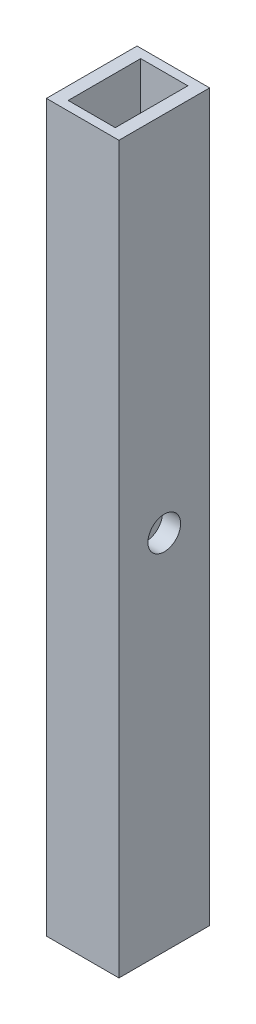
ISO-10303-21;
HEADER;
FILE_DESCRIPTION(('STEP AP214'),'2;1');
FILE_NAME('part.step','',(''),(''),'','','');
FILE_SCHEMA(('AUTOMOTIVE_DESIGN { 1 0 10303 214 1 1 1 1 }'));
ENDSEC;
DATA;
#1=APPLICATION_CONTEXT('core data for automotive mechanical design processes');
#2=APPLICATION_PROTOCOL_DEFINITION('international standard','automotive_design',2000,#1);
#3=PRODUCT_CONTEXT('',#1,'mechanical');
#4=PRODUCT('Part','Part','',(#3));
#5=PRODUCT_RELATED_PRODUCT_CATEGORY('part','',(#4));
#6=PRODUCT_DEFINITION_FORMATION('','',#4);
#7=PRODUCT_DEFINITION_CONTEXT('part definition',#1,'design');
#8=PRODUCT_DEFINITION('design','',#6,#7);
#9=PRODUCT_DEFINITION_SHAPE('','',#8);
#10=(LENGTH_UNIT() NAMED_UNIT(*) SI_UNIT(.MILLI.,.METRE.));
#11=(NAMED_UNIT(*) PLANE_ANGLE_UNIT() SI_UNIT($,.RADIAN.));
#12=(NAMED_UNIT(*) SI_UNIT($,.STERADIAN.) SOLID_ANGLE_UNIT());
#13=UNCERTAINTY_MEASURE_WITH_UNIT(LENGTH_MEASURE(1.E-05),#10,'distance_accuracy_value','');
#14=(GEOMETRIC_REPRESENTATION_CONTEXT(3) GLOBAL_UNCERTAINTY_ASSIGNED_CONTEXT((#13)) GLOBAL_UNIT_ASSIGNED_CONTEXT((#10,
#11,#12)) REPRESENTATION_CONTEXT('',''));
#15=CARTESIAN_POINT('',(0.,0.,0.));
#16=DIRECTION('',(0.,0.,1.));
#17=DIRECTION('',(1.,0.,0.));
#18=AXIS2_PLACEMENT_3D('',#15,#16,#17);
#19=CARTESIAN_POINT('',(50.,500.,-62.5));
#20=DIRECTION('',(-1.,0.,0.));
#21=DIRECTION('',(0.,0.,1.));
#22=AXIS2_PLACEMENT_3D('',#19,#20,#21);
#23=PLANE('',#22);
#24=CARTESIAN_POINT('',(50.,0.,0.));
#25=DIRECTION('',(1.,0.,0.));
#26=DIRECTION('',(0.,0.,-1.));
#27=AXIS2_PLACEMENT_3D('',#24,#25,#26);
#28=CIRCLE('',#27,22.5);
#29=CARTESIAN_POINT('',(50.,0.,-22.5));
#30=VERTEX_POINT('',#29);
#31=EDGE_CURVE('E174',#30,#30,#28,.T.);
#32=ORIENTED_EDGE('',*,*,#31,.F.);
#33=EDGE_LOOP('',(#32));
#34=FACE_BOUND('',#33,.T.);
#35=DIRECTION('',(0.,0.,-1.));
#36=VECTOR('',#35,1.);
#37=CARTESIAN_POINT('',(50.,-500.,-62.5));
#38=LINE('',#37,#36);
#39=CARTESIAN_POINT('',(50.,-500.,62.5));
#40=VERTEX_POINT('',#39);
#41=CARTESIAN_POINT('',(50.,-500.,-62.5));
#42=VERTEX_POINT('',#41);
#43=EDGE_CURVE('E182',#40,#42,#38,.T.);
#44=ORIENTED_EDGE('',*,*,#43,.T.);
#45=DIRECTION('',(0.,-1.,0.));
#46=VECTOR('',#45,1.);
#47=CARTESIAN_POINT('',(50.,500.,-62.5));
#48=LINE('',#47,#46);
#49=CARTESIAN_POINT('',(50.,500.,-62.5));
#50=VERTEX_POINT('',#49);
#51=EDGE_CURVE('E11',#50,#42,#48,.T.);
#52=ORIENTED_EDGE('',*,*,#51,.F.);
#53=DIRECTION('',(0.,0.,-1.));
#54=VECTOR('',#53,1.);
#55=CARTESIAN_POINT('',(50.,500.,-62.5));
#56=LINE('',#55,#54);
#57=CARTESIAN_POINT('',(50.,500.,62.5));
#58=VERTEX_POINT('',#57);
#59=EDGE_CURVE('E186',#58,#50,#56,.T.);
#60=ORIENTED_EDGE('',*,*,#59,.F.);
#61=DIRECTION('',(0.,-1.,0.));
#62=VECTOR('',#61,1.);
#63=CARTESIAN_POINT('',(50.,500.,62.5));
#64=LINE('',#63,#62);
#65=EDGE_CURVE('E196',#58,#40,#64,.T.);
#66=ORIENTED_EDGE('',*,*,#65,.T.);
#67=EDGE_LOOP('',(#44,#52,#60,#66));
#68=FACE_BOUND('',#67,.T.);
#69=ADVANCED_FACE('F45',(#34,#68),#23,.F.);
#70=CARTESIAN_POINT('',(-50.,500.,-62.5));
#71=DIRECTION('',(0.,0.,1.));
#72=DIRECTION('',(1.,0.,0.));
#73=AXIS2_PLACEMENT_3D('',#70,#71,#72);
#74=PLANE('',#73);
#75=DIRECTION('',(-1.,0.,0.));
#76=VECTOR('',#75,1.);
#77=CARTESIAN_POINT('',(-50.,-500.,-62.5));
#78=LINE('',#77,#76);
#79=CARTESIAN_POINT('',(-50.,-500.,-62.5));
#80=VERTEX_POINT('',#79);
#81=EDGE_CURVE('E200',#42,#80,#78,.T.);
#82=ORIENTED_EDGE('',*,*,#81,.T.);
#83=DIRECTION('',(0.,-1.,0.));
#84=VECTOR('',#83,1.);
#85=CARTESIAN_POINT('',(-50.,500.,-62.5));
#86=LINE('',#85,#84);
#87=CARTESIAN_POINT('',(-50.,500.,-62.5));
#88=VERTEX_POINT('',#87);
#89=EDGE_CURVE('E53',#88,#80,#86,.T.);
#90=ORIENTED_EDGE('',*,*,#89,.F.);
#91=DIRECTION('',(-1.,0.,0.));
#92=VECTOR('',#91,1.);
#93=CARTESIAN_POINT('',(-50.,500.,-62.5));
#94=LINE('',#93,#92);
#95=EDGE_CURVE('E97',#50,#88,#94,.T.);
#96=ORIENTED_EDGE('',*,*,#95,.F.);
#97=ORIENTED_EDGE('',*,*,#51,.T.);
#98=EDGE_LOOP('',(#82,#90,#96,#97));
#99=FACE_BOUND('',#98,.T.);
#100=ADVANCED_FACE('F237',(#99),#74,.F.);
#101=CARTESIAN_POINT('',(-50.,500.,-62.5));
#102=DIRECTION('',(1.,0.,0.));
#103=DIRECTION('',(0.,0.,-1.));
#104=AXIS2_PLACEMENT_3D('',#101,#102,#103);
#105=PLANE('',#104);
#106=CARTESIAN_POINT('',(-50.,0.,0.));
#107=DIRECTION('',(-1.,0.,0.));
#108=DIRECTION('',(0.,0.,1.));
#109=AXIS2_PLACEMENT_3D('',#106,#107,#108);
#110=CIRCLE('',#109,22.5);
#111=CARTESIAN_POINT('',(-50.,0.,22.5));
#112=VERTEX_POINT('',#111);
#113=EDGE_CURVE('E164',#112,#112,#110,.T.);
#114=ORIENTED_EDGE('',*,*,#113,.F.);
#115=EDGE_LOOP('',(#114));
#116=FACE_BOUND('',#115,.T.);
#117=DIRECTION('',(0.,0.,1.));
#118=VECTOR('',#117,1.);
#119=CARTESIAN_POINT('',(-50.,-500.,-62.5));
#120=LINE('',#119,#118);
#121=CARTESIAN_POINT('',(-50.,-500.,62.5));
#122=VERTEX_POINT('',#121);
#123=EDGE_CURVE('E203',#80,#122,#120,.T.);
#124=ORIENTED_EDGE('',*,*,#123,.T.);
#125=DIRECTION('',(0.,-1.,0.));
#126=VECTOR('',#125,1.);
#127=CARTESIAN_POINT('',(-50.,500.,62.5));
#128=LINE('',#127,#126);
#129=CARTESIAN_POINT('',(-50.,500.,62.5));
#130=VERTEX_POINT('',#129);
#131=EDGE_CURVE('E210',#130,#122,#128,.T.);
#132=ORIENTED_EDGE('',*,*,#131,.F.);
#133=DIRECTION('',(0.,0.,1.));
#134=VECTOR('',#133,1.);
#135=CARTESIAN_POINT('',(-50.,500.,-62.5));
#136=LINE('',#135,#134);
#137=EDGE_CURVE('E191',#88,#130,#136,.T.);
#138=ORIENTED_EDGE('',*,*,#137,.F.);
#139=ORIENTED_EDGE('',*,*,#89,.T.);
#140=EDGE_LOOP('',(#124,#132,#138,#139));
#141=FACE_BOUND('',#140,.T.);
#142=ADVANCED_FACE('F217',(#116,#141),#105,.F.);
#143=CARTESIAN_POINT('',(-50.,500.,62.5));
#144=DIRECTION('',(0.,0.,-1.));
#145=DIRECTION('',(-1.,0.,0.));
#146=AXIS2_PLACEMENT_3D('',#143,#144,#145);
#147=PLANE('',#146);
#148=DIRECTION('',(1.,0.,0.));
#149=VECTOR('',#148,1.);
#150=CARTESIAN_POINT('',(-50.,-500.,62.5));
#151=LINE('',#150,#149);
#152=EDGE_CURVE('E90',#122,#40,#151,.T.);
#153=ORIENTED_EDGE('',*,*,#152,.T.);
#154=ORIENTED_EDGE('',*,*,#65,.F.);
#155=DIRECTION('',(1.,0.,0.));
#156=VECTOR('',#155,1.);
#157=CARTESIAN_POINT('',(-50.,500.,62.5));
#158=LINE('',#157,#156);
#159=EDGE_CURVE('E69',#130,#58,#158,.T.);
#160=ORIENTED_EDGE('',*,*,#159,.F.);
#161=ORIENTED_EDGE('',*,*,#131,.T.);
#162=EDGE_LOOP('',(#153,#154,#160,#161));
#163=FACE_BOUND('',#162,.T.);
#164=ADVANCED_FACE('F225',(#163),#147,.F.);
#165=CARTESIAN_POINT('',(0.,500.,0.));
#166=DIRECTION('',(0.,1.,0.));
#167=DIRECTION('',(0.,0.,1.));
#168=AXIS2_PLACEMENT_3D('',#165,#166,#167);
#169=PLANE('',#168);
#170=DIRECTION('',(0.,0.,-1.));
#171=VECTOR('',#170,1.);
#172=CARTESIAN_POINT('',(32.5,500.,-50.));
#173=LINE('',#172,#171);
#174=CARTESIAN_POINT('',(32.5,500.,50.));
#175=VERTEX_POINT('',#174);
#176=CARTESIAN_POINT('',(32.5,500.,-50.));
#177=VERTEX_POINT('',#176);
#178=EDGE_CURVE('E60',#175,#177,#173,.T.);
#179=ORIENTED_EDGE('',*,*,#178,.F.);
#180=DIRECTION('',(1.,0.,0.));
#181=VECTOR('',#180,1.);
#182=CARTESIAN_POINT('',(-32.5,500.,50.));
#183=LINE('',#182,#181);
#184=CARTESIAN_POINT('',(-32.5,500.,50.));
#185=VERTEX_POINT('',#184);
#186=EDGE_CURVE('E142',#185,#175,#183,.T.);
#187=ORIENTED_EDGE('',*,*,#186,.F.);
#188=DIRECTION('',(0.,0.,1.));
#189=VECTOR('',#188,1.);
#190=CARTESIAN_POINT('',(-32.5,500.,-50.));
#191=LINE('',#190,#189);
#192=CARTESIAN_POINT('',(-32.5,500.,-50.));
#193=VERTEX_POINT('',#192);
#194=EDGE_CURVE('E146',#193,#185,#191,.T.);
#195=ORIENTED_EDGE('',*,*,#194,.F.);
#196=DIRECTION('',(-1.,0.,0.));
#197=VECTOR('',#196,1.);
#198=CARTESIAN_POINT('',(-32.5,500.,-50.));
#199=LINE('',#198,#197);
#200=EDGE_CURVE('E155',#177,#193,#199,.T.);
#201=ORIENTED_EDGE('',*,*,#200,.F.);
#202=EDGE_LOOP('',(#179,#187,#195,#201));
#203=FACE_BOUND('',#202,.T.);
#204=ORIENTED_EDGE('',*,*,#59,.T.);
#205=ORIENTED_EDGE('',*,*,#95,.T.);
#206=ORIENTED_EDGE('',*,*,#137,.T.);
#207=ORIENTED_EDGE('',*,*,#159,.T.);
#208=EDGE_LOOP('',(#204,#205,#206,#207));
#209=FACE_BOUND('',#208,.T.);
#210=ADVANCED_FACE('F227',(#203,#209),#169,.T.);
#211=CARTESIAN_POINT('',(0.,-500.,0.));
#212=DIRECTION('',(0.,1.,0.));
#213=DIRECTION('',(0.,0.,1.));
#214=AXIS2_PLACEMENT_3D('',#211,#212,#213);
#215=PLANE('',#214);
#216=ORIENTED_EDGE('',*,*,#43,.F.);
#217=ORIENTED_EDGE('',*,*,#152,.F.);
#218=ORIENTED_EDGE('',*,*,#123,.F.);
#219=ORIENTED_EDGE('',*,*,#81,.F.);
#220=EDGE_LOOP('',(#216,#217,#218,#219));
#221=FACE_BOUND('',#220,.T.);
#222=ADVANCED_FACE('F221',(#221),#215,.F.);
#223=CARTESIAN_POINT('',(25.,0.,0.));
#224=DIRECTION('',(1.,0.,0.));
#225=DIRECTION('',(0.,0.,-1.));
#226=AXIS2_PLACEMENT_3D('',#223,#224,#225);
#227=CYLINDRICAL_SURFACE('',#226,22.5);
#228=CARTESIAN_POINT('',(25.,0.,0.));
#229=DIRECTION('',(1.,0.,0.));
#230=DIRECTION('',(0.,0.,-1.));
#231=AXIS2_PLACEMENT_3D('',#228,#229,#230);
#232=CIRCLE('',#231,22.5);
#233=CARTESIAN_POINT('',(25.,0.,-22.5));
#234=VERTEX_POINT('',#233);
#235=EDGE_CURVE('E178',#234,#234,#232,.T.);
#236=ORIENTED_EDGE('',*,*,#235,.F.);
#237=EDGE_LOOP('',(#236));
#238=FACE_BOUND('',#237,.T.);
#239=ORIENTED_EDGE('',*,*,#31,.T.);
#240=EDGE_LOOP('',(#239));
#241=FACE_BOUND('',#240,.T.);
#242=ADVANCED_FACE('F248',(#238,#241),#227,.F.);
#243=CARTESIAN_POINT('',(25.,0.,0.));
#244=DIRECTION('',(1.,0.,0.));
#245=DIRECTION('',(0.,0.,-1.));
#246=AXIS2_PLACEMENT_3D('',#243,#244,#245);
#247=PLANE('',#246);
#248=ORIENTED_EDGE('',*,*,#235,.T.);
#249=EDGE_LOOP('',(#248));
#250=FACE_BOUND('',#249,.T.);
#251=ADVANCED_FACE('F249',(#250),#247,.T.);
#252=CARTESIAN_POINT('',(-25.,0.,0.));
#253=DIRECTION('',(-1.,0.,0.));
#254=DIRECTION('',(0.,0.,1.));
#255=AXIS2_PLACEMENT_3D('',#252,#253,#254);
#256=CYLINDRICAL_SURFACE('',#255,22.5);
#257=CARTESIAN_POINT('',(-25.,0.,0.));
#258=DIRECTION('',(-1.,0.,0.));
#259=DIRECTION('',(0.,0.,1.));
#260=AXIS2_PLACEMENT_3D('',#257,#258,#259);
#261=CIRCLE('',#260,22.5);
#262=CARTESIAN_POINT('',(-25.,0.,22.5));
#263=VERTEX_POINT('',#262);
#264=EDGE_CURVE('E170',#263,#263,#261,.T.);
#265=ORIENTED_EDGE('',*,*,#264,.F.);
#266=EDGE_LOOP('',(#265));
#267=FACE_BOUND('',#266,.T.);
#268=ORIENTED_EDGE('',*,*,#113,.T.);
#269=EDGE_LOOP('',(#268));
#270=FACE_BOUND('',#269,.T.);
#271=ADVANCED_FACE('F255',(#267,#270),#256,.F.);
#272=CARTESIAN_POINT('',(-25.,0.,0.));
#273=DIRECTION('',(-1.,0.,0.));
#274=DIRECTION('',(0.,0.,1.));
#275=AXIS2_PLACEMENT_3D('',#272,#273,#274);
#276=PLANE('',#275);
#277=ORIENTED_EDGE('',*,*,#264,.T.);
#278=EDGE_LOOP('',(#277));
#279=FACE_BOUND('',#278,.T.);
#280=ADVANCED_FACE('F262',(#279),#276,.T.);
#281=CARTESIAN_POINT('',(32.5,100.,-50.));
#282=DIRECTION('',(1.,0.,0.));
#283=DIRECTION('',(0.,0.,-1.));
#284=AXIS2_PLACEMENT_3D('',#281,#282,#283);
#285=PLANE('',#284);
#286=ORIENTED_EDGE('',*,*,#178,.T.);
#287=DIRECTION('',(0.,1.,0.));
#288=VECTOR('',#287,1.);
#289=CARTESIAN_POINT('',(32.5,100.,-50.));
#290=LINE('',#289,#288);
#291=CARTESIAN_POINT('',(32.5,100.,-50.));
#292=VERTEX_POINT('',#291);
#293=EDGE_CURVE('E117',#292,#177,#290,.T.);
#294=ORIENTED_EDGE('',*,*,#293,.F.);
#295=DIRECTION('',(0.,0.,-1.));
#296=VECTOR('',#295,1.);
#297=CARTESIAN_POINT('',(32.5,100.,-50.));
#298=LINE('',#297,#296);
#299=CARTESIAN_POINT('',(32.5,100.,50.));
#300=VERTEX_POINT('',#299);
#301=EDGE_CURVE('E121',#300,#292,#298,.T.);
#302=ORIENTED_EDGE('',*,*,#301,.F.);
#303=DIRECTION('',(0.,1.,0.));
#304=VECTOR('',#303,1.);
#305=CARTESIAN_POINT('',(32.5,100.,50.));
#306=LINE('',#305,#304);
#307=EDGE_CURVE('E161',#300,#175,#306,.T.);
#308=ORIENTED_EDGE('',*,*,#307,.T.);
#309=EDGE_LOOP('',(#286,#294,#302,#308));
#310=FACE_BOUND('',#309,.T.);
#311=ADVANCED_FACE('F119',(#310),#285,.F.);
#312=CARTESIAN_POINT('',(-32.5,100.,50.));
#313=DIRECTION('',(0.,0.,1.));
#314=DIRECTION('',(1.,0.,0.));
#315=AXIS2_PLACEMENT_3D('',#312,#313,#314);
#316=PLANE('',#315);
#317=ORIENTED_EDGE('',*,*,#186,.T.);
#318=ORIENTED_EDGE('',*,*,#307,.F.);
#319=DIRECTION('',(1.,0.,0.));
#320=VECTOR('',#319,1.);
#321=CARTESIAN_POINT('',(-32.5,100.,50.));
#322=LINE('',#321,#320);
#323=CARTESIAN_POINT('',(-32.5,100.,50.));
#324=VERTEX_POINT('',#323);
#325=EDGE_CURVE('E128',#324,#300,#322,.T.);
#326=ORIENTED_EDGE('',*,*,#325,.F.);
#327=DIRECTION('',(0.,1.,0.));
#328=VECTOR('',#327,1.);
#329=CARTESIAN_POINT('',(-32.5,100.,50.));
#330=LINE('',#329,#328);
#331=EDGE_CURVE('E165',#324,#185,#330,.T.);
#332=ORIENTED_EDGE('',*,*,#331,.T.);
#333=EDGE_LOOP('',(#317,#318,#326,#332));
#334=FACE_BOUND('',#333,.T.);
#335=ADVANCED_FACE('F269',(#334),#316,.F.);
#336=CARTESIAN_POINT('',(-32.5,100.,-50.));
#337=DIRECTION('',(-1.,0.,0.));
#338=DIRECTION('',(0.,0.,1.));
#339=AXIS2_PLACEMENT_3D('',#336,#337,#338);
#340=PLANE('',#339);
#341=ORIENTED_EDGE('',*,*,#194,.T.);
#342=ORIENTED_EDGE('',*,*,#331,.F.);
#343=DIRECTION('',(0.,0.,1.));
#344=VECTOR('',#343,1.);
#345=CARTESIAN_POINT('',(-32.5,100.,-50.));
#346=LINE('',#345,#344);
#347=CARTESIAN_POINT('',(-32.5,100.,-50.));
#348=VERTEX_POINT('',#347);
#349=EDGE_CURVE('E137',#348,#324,#346,.T.);
#350=ORIENTED_EDGE('',*,*,#349,.F.);
#351=DIRECTION('',(0.,1.,0.));
#352=VECTOR('',#351,1.);
#353=CARTESIAN_POINT('',(-32.5,100.,-50.));
#354=LINE('',#353,#352);
#355=EDGE_CURVE('E127',#348,#193,#354,.T.);
#356=ORIENTED_EDGE('',*,*,#355,.T.);
#357=EDGE_LOOP('',(#341,#342,#350,#356));
#358=FACE_BOUND('',#357,.T.);
#359=ADVANCED_FACE('F272',(#358),#340,.F.);
#360=CARTESIAN_POINT('',(-32.5,100.,-50.));
#361=DIRECTION('',(0.,0.,-1.));
#362=DIRECTION('',(-1.,0.,0.));
#363=AXIS2_PLACEMENT_3D('',#360,#361,#362);
#364=PLANE('',#363);
#365=ORIENTED_EDGE('',*,*,#200,.T.);
#366=ORIENTED_EDGE('',*,*,#355,.F.);
#367=DIRECTION('',(-1.,0.,0.));
#368=VECTOR('',#367,1.);
#369=CARTESIAN_POINT('',(-32.5,100.,-50.));
#370=LINE('',#369,#368);
#371=EDGE_CURVE('E131',#292,#348,#370,.T.);
#372=ORIENTED_EDGE('',*,*,#371,.F.);
#373=ORIENTED_EDGE('',*,*,#293,.T.);
#374=EDGE_LOOP('',(#365,#366,#372,#373));
#375=FACE_BOUND('',#374,.T.);
#376=ADVANCED_FACE('F132',(#375),#364,.F.);
#377=CARTESIAN_POINT('',(0.,100.,0.));
#378=DIRECTION('',(0.,1.,0.));
#379=DIRECTION('',(0.,0.,1.));
#380=AXIS2_PLACEMENT_3D('',#377,#378,#379);
#381=PLANE('',#380);
#382=ORIENTED_EDGE('',*,*,#301,.T.);
#383=ORIENTED_EDGE('',*,*,#371,.T.);
#384=ORIENTED_EDGE('',*,*,#349,.T.);
#385=ORIENTED_EDGE('',*,*,#325,.T.);
#386=EDGE_LOOP('',(#382,#383,#384,#385));
#387=FACE_BOUND('',#386,.T.);
#388=ADVANCED_FACE('F139',(#387),#381,.T.);
#389=CLOSED_SHELL('',(#69,#100,#142,#164,#210,#222,#242,#251,#271,#280,#311,#335,#359,#376,#388));
#390=MANIFOLD_SOLID_BREP('B2',#389);
#391=ADVANCED_BREP_SHAPE_REPRESENTATION('',(#18,#390),#14);
#392=SHAPE_DEFINITION_REPRESENTATION(#9,#391);
ENDSEC;
END-ISO-10303-21;
